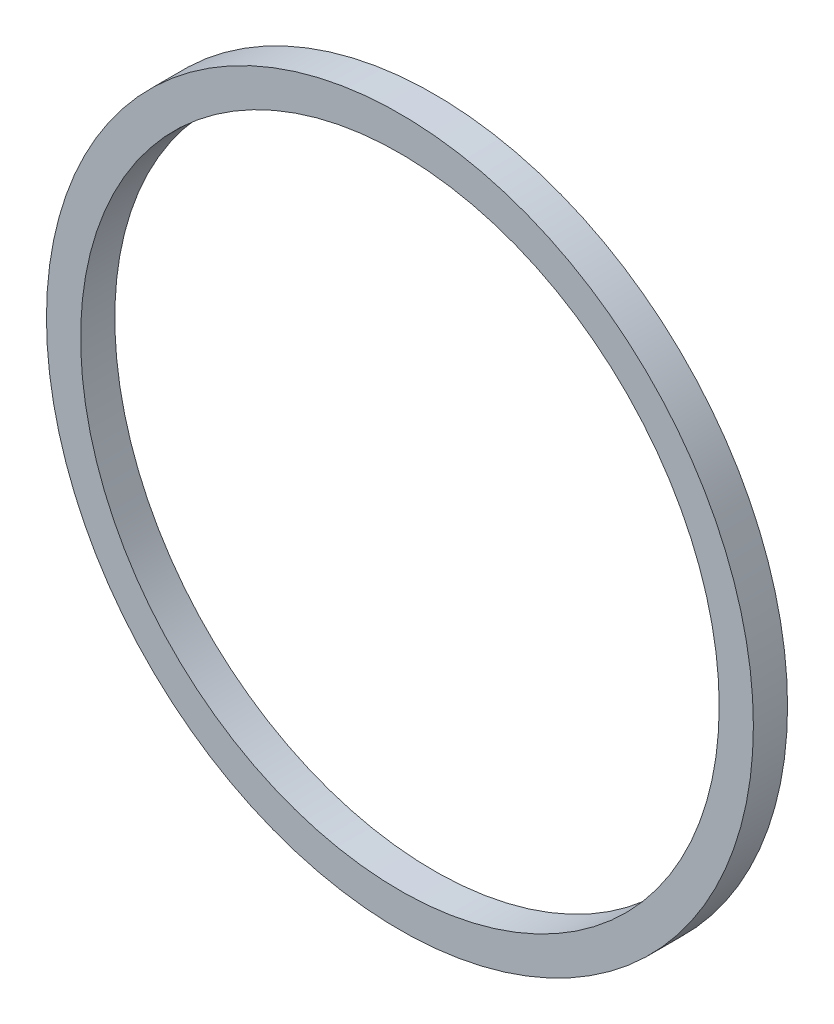
ISO-10303-21;
HEADER;
FILE_DESCRIPTION(('STEP AP214'),'2;1');
FILE_NAME('part.step','',(''),(''),'','','');
FILE_SCHEMA(('AUTOMOTIVE_DESIGN { 1 0 10303 214 1 1 1 1 }'));
ENDSEC;
DATA;
#1=APPLICATION_CONTEXT('core data for automotive mechanical design processes');
#2=APPLICATION_PROTOCOL_DEFINITION('international standard','automotive_design',2000,#1);
#3=PRODUCT_CONTEXT('',#1,'mechanical');
#4=PRODUCT('Part','Part','',(#3));
#5=PRODUCT_RELATED_PRODUCT_CATEGORY('part','',(#4));
#6=PRODUCT_DEFINITION_FORMATION('','',#4);
#7=PRODUCT_DEFINITION_CONTEXT('part definition',#1,'design');
#8=PRODUCT_DEFINITION('design','',#6,#7);
#9=PRODUCT_DEFINITION_SHAPE('','',#8);
#10=(LENGTH_UNIT() NAMED_UNIT(*) SI_UNIT(.MILLI.,.METRE.));
#11=(NAMED_UNIT(*) PLANE_ANGLE_UNIT() SI_UNIT($,.RADIAN.));
#12=(NAMED_UNIT(*) SI_UNIT($,.STERADIAN.) SOLID_ANGLE_UNIT());
#13=UNCERTAINTY_MEASURE_WITH_UNIT(LENGTH_MEASURE(1.E-05),#10,'distance_accuracy_value','');
#14=(GEOMETRIC_REPRESENTATION_CONTEXT(3) GLOBAL_UNCERTAINTY_ASSIGNED_CONTEXT((#13)) GLOBAL_UNIT_ASSIGNED_CONTEXT((#10,
#11,#12)) REPRESENTATION_CONTEXT('',''));
#15=CARTESIAN_POINT('',(0.,0.,0.));
#16=DIRECTION('',(0.,0.,1.));
#17=DIRECTION('',(1.,0.,0.));
#18=AXIS2_PLACEMENT_3D('',#15,#16,#17);
#19=CARTESIAN_POINT('',(0.,0.,1.3081));
#20=DIRECTION('',(0.,0.,1.));
#21=DIRECTION('',(1.,0.,0.));
#22=AXIS2_PLACEMENT_3D('',#19,#20,#21);
#23=CYLINDRICAL_SURFACE('',#22,24.4475);
#24=CARTESIAN_POINT('',(0.,0.,-1.3081));
#25=DIRECTION('',(0.,0.,1.));
#26=DIRECTION('',(1.,0.,0.));
#27=AXIS2_PLACEMENT_3D('',#24,#25,#26);
#28=CIRCLE('',#27,24.4475);
#29=CARTESIAN_POINT('',(24.4475,0.,-1.30810000000001));
#30=VERTEX_POINT('',#29);
#31=EDGE_CURVE('E46',#30,#30,#28,.T.);
#32=ORIENTED_EDGE('',*,*,#31,.F.);
#33=EDGE_LOOP('',(#32));
#34=FACE_BOUND('',#33,.T.);
#35=CARTESIAN_POINT('',(0.,0.,1.30809999999999));
#36=DIRECTION('',(0.,0.,1.));
#37=DIRECTION('',(1.,0.,0.));
#38=AXIS2_PLACEMENT_3D('',#35,#36,#37);
#39=CIRCLE('',#38,24.4475);
#40=CARTESIAN_POINT('',(24.4475,0.,1.30809999999999));
#41=VERTEX_POINT('',#40);
#42=EDGE_CURVE('E10',#41,#41,#39,.T.);
#43=ORIENTED_EDGE('',*,*,#42,.T.);
#44=EDGE_LOOP('',(#43));
#45=FACE_BOUND('',#44,.T.);
#46=ADVANCED_FACE('F32',(#34,#45),#23,.F.);
#47=CARTESIAN_POINT('',(-27.0637,0.,1.3081));
#48=DIRECTION('',(0.,0.,-1.));
#49=DIRECTION('',(-1.,0.,0.));
#50=AXIS2_PLACEMENT_3D('',#47,#48,#49);
#51=PLANE('',#50);
#52=ORIENTED_EDGE('',*,*,#42,.F.);
#53=EDGE_LOOP('',(#52));
#54=FACE_BOUND('',#53,.T.);
#55=CARTESIAN_POINT('',(0.,0.,1.30809999999999));
#56=DIRECTION('',(0.,0.,1.));
#57=DIRECTION('',(1.,0.,0.));
#58=AXIS2_PLACEMENT_3D('',#55,#56,#57);
#59=CIRCLE('',#58,27.0637);
#60=CARTESIAN_POINT('',(27.0637,0.,1.30809999999999));
#61=VERTEX_POINT('',#60);
#62=EDGE_CURVE('E38',#61,#61,#59,.T.);
#63=ORIENTED_EDGE('',*,*,#62,.T.);
#64=EDGE_LOOP('',(#63));
#65=FACE_BOUND('',#64,.T.);
#66=ADVANCED_FACE('F55',(#54,#65),#51,.F.);
#67=CARTESIAN_POINT('',(0.,0.,1.3081));
#68=DIRECTION('',(0.,0.,1.));
#69=DIRECTION('',(1.,0.,0.));
#70=AXIS2_PLACEMENT_3D('',#67,#68,#69);
#71=CYLINDRICAL_SURFACE('',#70,27.0637);
#72=ORIENTED_EDGE('',*,*,#62,.F.);
#73=EDGE_LOOP('',(#72));
#74=FACE_BOUND('',#73,.T.);
#75=CARTESIAN_POINT('',(0.,0.,-1.3081));
#76=DIRECTION('',(0.,0.,1.));
#77=DIRECTION('',(1.,0.,0.));
#78=AXIS2_PLACEMENT_3D('',#75,#76,#77);
#79=CIRCLE('',#78,27.0637);
#80=CARTESIAN_POINT('',(27.0637,0.,-1.30810000000001));
#81=VERTEX_POINT('',#80);
#82=EDGE_CURVE('E42',#81,#81,#79,.T.);
#83=ORIENTED_EDGE('',*,*,#82,.T.);
#84=EDGE_LOOP('',(#83));
#85=FACE_BOUND('',#84,.T.);
#86=ADVANCED_FACE('F59',(#74,#85),#71,.T.);
#87=CARTESIAN_POINT('',(-27.0637,0.,-1.3081));
#88=DIRECTION('',(0.,0.,1.));
#89=DIRECTION('',(1.,0.,0.));
#90=AXIS2_PLACEMENT_3D('',#87,#88,#89);
#91=PLANE('',#90);
#92=ORIENTED_EDGE('',*,*,#82,.F.);
#93=EDGE_LOOP('',(#92));
#94=FACE_BOUND('',#93,.T.);
#95=ORIENTED_EDGE('',*,*,#31,.T.);
#96=EDGE_LOOP('',(#95));
#97=FACE_BOUND('',#96,.T.);
#98=ADVANCED_FACE('F52',(#94,#97),#91,.F.);
#99=CLOSED_SHELL('',(#46,#66,#86,#98));
#100=MANIFOLD_SOLID_BREP('B2',#99);
#101=ADVANCED_BREP_SHAPE_REPRESENTATION('',(#18,#100),#14);
#102=SHAPE_DEFINITION_REPRESENTATION(#9,#101);
ENDSEC;
END-ISO-10303-21;
